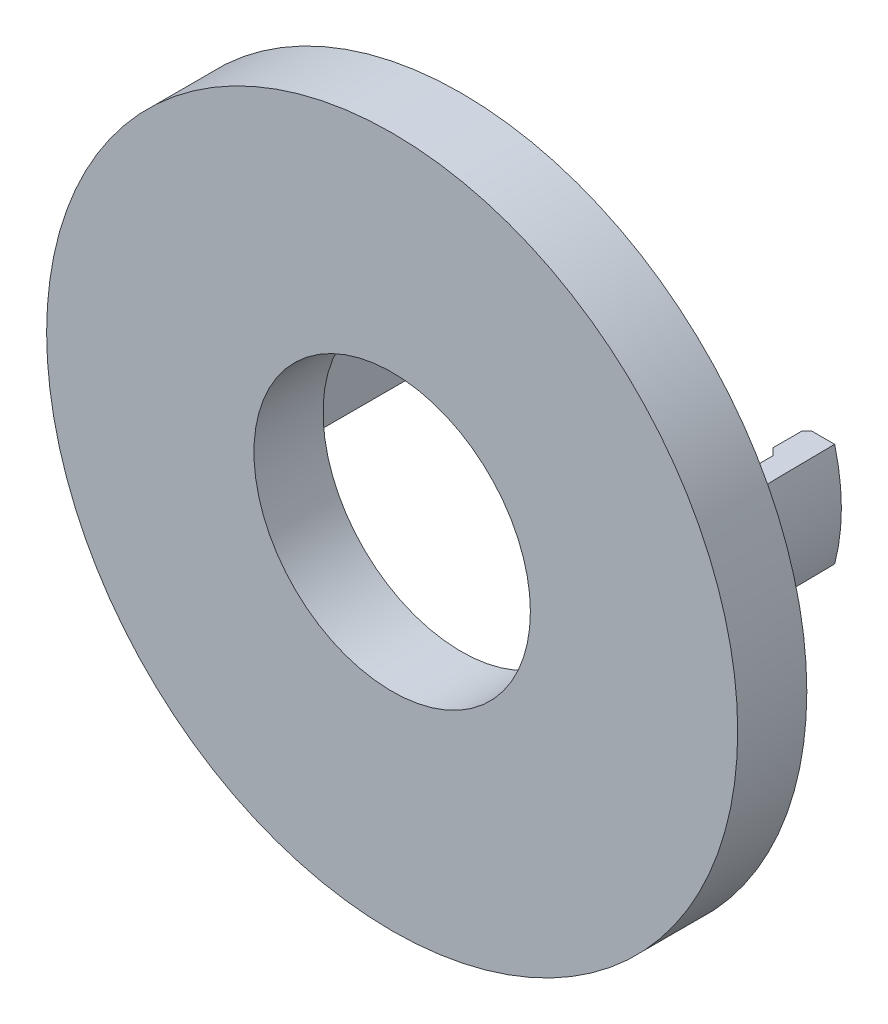
ISO-10303-21;
HEADER;
FILE_DESCRIPTION(('STEP AP214'),'2;1');
FILE_NAME('part.step','',(''),(''),'','','');
FILE_SCHEMA(('AUTOMOTIVE_DESIGN { 1 0 10303 214 1 1 1 1 }'));
ENDSEC;
DATA;
#1=APPLICATION_CONTEXT('core data for automotive mechanical design processes');
#2=APPLICATION_PROTOCOL_DEFINITION('international standard','automotive_design',2000,#1);
#3=PRODUCT_CONTEXT('',#1,'mechanical');
#4=PRODUCT('Part','Part','',(#3));
#5=PRODUCT_RELATED_PRODUCT_CATEGORY('part','',(#4));
#6=PRODUCT_DEFINITION_FORMATION('','',#4);
#7=PRODUCT_DEFINITION_CONTEXT('part definition',#1,'design');
#8=PRODUCT_DEFINITION('design','',#6,#7);
#9=PRODUCT_DEFINITION_SHAPE('','',#8);
#10=(LENGTH_UNIT() NAMED_UNIT(*) SI_UNIT(.MILLI.,.METRE.));
#11=(NAMED_UNIT(*) PLANE_ANGLE_UNIT() SI_UNIT($,.RADIAN.));
#12=(NAMED_UNIT(*) SI_UNIT($,.STERADIAN.) SOLID_ANGLE_UNIT());
#13=UNCERTAINTY_MEASURE_WITH_UNIT(LENGTH_MEASURE(1.E-05),#10,'distance_accuracy_value','');
#14=(GEOMETRIC_REPRESENTATION_CONTEXT(3) GLOBAL_UNCERTAINTY_ASSIGNED_CONTEXT((#13)) GLOBAL_UNIT_ASSIGNED_CONTEXT((#10,
#11,#12)) REPRESENTATION_CONTEXT('',''));
#15=CARTESIAN_POINT('',(0.,0.,0.));
#16=DIRECTION('',(0.,0.,1.));
#17=DIRECTION('',(1.,0.,0.));
#18=AXIS2_PLACEMENT_3D('',#15,#16,#17);
#19=CARTESIAN_POINT('',(0.,0.,0.));
#20=DIRECTION('',(0.,0.,1.));
#21=DIRECTION('',(1.,0.,0.));
#22=AXIS2_PLACEMENT_3D('',#19,#20,#21);
#23=PLANE('',#22);
#24=CARTESIAN_POINT('',(0.,0.,0.));
#25=DIRECTION('',(0.,0.,1.));
#26=DIRECTION('',(1.,0.,0.));
#27=AXIS2_PLACEMENT_3D('',#24,#25,#26);
#28=CIRCLE('',#27,15.5);
#29=CARTESIAN_POINT('',(15.039531242695,-3.75,0.));
#30=VERTEX_POINT('',#29);
#31=CARTESIAN_POINT('',(15.039531242695,3.75,0.));
#32=VERTEX_POINT('',#31);
#33=EDGE_CURVE('E56',#30,#32,#28,.T.);
#34=ORIENTED_EDGE('',*,*,#33,.T.);
#35=DIRECTION('',(-1.,0.,0.));
#36=VECTOR('',#35,1.);
#37=CARTESIAN_POINT('',(0.,3.75,0.));
#38=LINE('',#37,#36);
#39=CARTESIAN_POINT('',(10.3535533905933,3.75,0.));
#40=VERTEX_POINT('',#39);
#41=EDGE_CURVE('E61',#32,#40,#38,.T.);
#42=ORIENTED_EDGE('',*,*,#41,.T.);
#43=DIRECTION('',(0.,1.,0.));
#44=VECTOR('',#43,1.);
#45=CARTESIAN_POINT('',(10.3535533905933,-3.75,0.));
#46=LINE('',#45,#44);
#47=CARTESIAN_POINT('',(10.3535533905933,-3.75,0.));
#48=VERTEX_POINT('',#47);
#49=EDGE_CURVE('E321',#48,#40,#46,.T.);
#50=ORIENTED_EDGE('',*,*,#49,.F.);
#51=DIRECTION('',(-1.,0.,0.));
#52=VECTOR('',#51,1.);
#53=CARTESIAN_POINT('',(0.,-3.75,0.));
#54=LINE('',#53,#52);
#55=EDGE_CURVE('E350',#30,#48,#54,.T.);
#56=ORIENTED_EDGE('',*,*,#55,.F.);
#57=EDGE_LOOP('',(#34,#42,#50,#56));
#58=FACE_BOUND('',#57,.T.);
#59=DIRECTION('',(1.,0.,0.));
#60=VECTOR('',#59,1.);
#61=CARTESIAN_POINT('',(0.,3.75,0.));
#62=LINE('',#61,#60);
#63=CARTESIAN_POINT('',(-15.039531242695,3.75,0.));
#64=VERTEX_POINT('',#63);
#65=CARTESIAN_POINT('',(-10.3535533905933,3.75,0.));
#66=VERTEX_POINT('',#65);
#67=EDGE_CURVE('E167',#64,#66,#62,.T.);
#68=ORIENTED_EDGE('',*,*,#67,.F.);
#69=CARTESIAN_POINT('',(0.,0.,0.));
#70=DIRECTION('',(0.,0.,-1.));
#71=DIRECTION('',(-1.,0.,0.));
#72=AXIS2_PLACEMENT_3D('',#69,#70,#71);
#73=CIRCLE('',#72,15.5);
#74=CARTESIAN_POINT('',(-15.039531242695,-3.75,0.));
#75=VERTEX_POINT('',#74);
#76=EDGE_CURVE('E152',#75,#64,#73,.T.);
#77=ORIENTED_EDGE('',*,*,#76,.F.);
#78=DIRECTION('',(1.,0.,0.));
#79=VECTOR('',#78,1.);
#80=CARTESIAN_POINT('',(0.,-3.75,0.));
#81=LINE('',#80,#79);
#82=CARTESIAN_POINT('',(-10.3535533905933,-3.75,0.));
#83=VERTEX_POINT('',#82);
#84=EDGE_CURVE('E198',#75,#83,#81,.T.);
#85=ORIENTED_EDGE('',*,*,#84,.T.);
#86=DIRECTION('',(0.,1.,0.));
#87=VECTOR('',#86,1.);
#88=CARTESIAN_POINT('',(-10.3535533905933,-3.75,0.));
#89=LINE('',#88,#87);
#90=EDGE_CURVE('E175',#83,#66,#89,.T.);
#91=ORIENTED_EDGE('',*,*,#90,.T.);
#92=EDGE_LOOP('',(#68,#77,#85,#91));
#93=FACE_BOUND('',#92,.T.);
#94=CARTESIAN_POINT('',(0.,0.,0.));
#95=DIRECTION('',(0.,0.,1.));
#96=DIRECTION('',(1.,0.,0.));
#97=AXIS2_PLACEMENT_3D('',#94,#95,#96);
#98=CIRCLE('',#97,10.);
#99=CARTESIAN_POINT('',(10.,0.,0.));
#100=VERTEX_POINT('',#99);
#101=EDGE_CURVE('E314',#100,#100,#98,.T.);
#102=ORIENTED_EDGE('',*,*,#101,.T.);
#103=EDGE_LOOP('',(#102));
#104=FACE_BOUND('',#103,.T.);
#105=CARTESIAN_POINT('',(0.,0.,0.));
#106=DIRECTION('',(0.,0.,1.));
#107=DIRECTION('',(1.,0.,0.));
#108=AXIS2_PLACEMENT_3D('',#105,#106,#107);
#109=CIRCLE('',#108,25.);
#110=CARTESIAN_POINT('',(25.,0.,0.));
#111=VERTEX_POINT('',#110);
#112=EDGE_CURVE('E312',#111,#111,#109,.T.);
#113=ORIENTED_EDGE('',*,*,#112,.F.);
#114=EDGE_LOOP('',(#113));
#115=FACE_BOUND('',#114,.T.);
#116=ADVANCED_FACE('F36',(#58,#93,#104,#115),#23,.F.);
#117=CARTESIAN_POINT('',(0.,0.,5.));
#118=DIRECTION('',(0.,0.,-1.));
#119=DIRECTION('',(-1.,0.,0.));
#120=AXIS2_PLACEMENT_3D('',#117,#118,#119);
#121=CYLINDRICAL_SURFACE('',#120,25.);
#122=CARTESIAN_POINT('',(0.,0.,5.));
#123=DIRECTION('',(0.,0.,1.));
#124=DIRECTION('',(1.,0.,0.));
#125=AXIS2_PLACEMENT_3D('',#122,#123,#124);
#126=CIRCLE('',#125,25.);
#127=CARTESIAN_POINT('',(25.,0.,5.));
#128=VERTEX_POINT('',#127);
#129=EDGE_CURVE('E309',#128,#128,#126,.T.);
#130=ORIENTED_EDGE('',*,*,#129,.F.);
#131=EDGE_LOOP('',(#130));
#132=FACE_BOUND('',#131,.T.);
#133=ORIENTED_EDGE('',*,*,#112,.T.);
#134=EDGE_LOOP('',(#133));
#135=FACE_BOUND('',#134,.T.);
#136=ADVANCED_FACE('F38',(#132,#135),#121,.T.);
#137=CARTESIAN_POINT('',(0.,0.,5.));
#138=DIRECTION('',(0.,0.,1.));
#139=DIRECTION('',(1.,0.,0.));
#140=AXIS2_PLACEMENT_3D('',#137,#138,#139);
#141=PLANE('',#140);
#142=CARTESIAN_POINT('',(0.,0.,5.));
#143=DIRECTION('',(0.,0.,1.));
#144=DIRECTION('',(1.,0.,0.));
#145=AXIS2_PLACEMENT_3D('',#142,#143,#144);
#146=CIRCLE('',#145,10.);
#147=CARTESIAN_POINT('',(10.,0.,5.));
#148=VERTEX_POINT('',#147);
#149=EDGE_CURVE('E317',#148,#148,#146,.T.);
#150=ORIENTED_EDGE('',*,*,#149,.F.);
#151=EDGE_LOOP('',(#150));
#152=FACE_BOUND('',#151,.T.);
#153=ORIENTED_EDGE('',*,*,#129,.T.);
#154=EDGE_LOOP('',(#153));
#155=FACE_BOUND('',#154,.T.);
#156=ADVANCED_FACE('F295',(#152,#155),#141,.T.);
#157=CARTESIAN_POINT('',(0.,0.,0.));
#158=DIRECTION('',(0.,0.,1.));
#159=DIRECTION('',(1.,0.,0.));
#160=AXIS2_PLACEMENT_3D('',#157,#158,#159);
#161=CYLINDRICAL_SURFACE('',#160,10.);
#162=ORIENTED_EDGE('',*,*,#101,.F.);
#163=EDGE_LOOP('',(#162));
#164=FACE_BOUND('',#163,.T.);
#165=ORIENTED_EDGE('',*,*,#149,.T.);
#166=EDGE_LOOP('',(#165));
#167=FACE_BOUND('',#166,.T.);
#168=ADVANCED_FACE('F273',(#164,#167),#161,.F.);
#169=CARTESIAN_POINT('',(5.17677669529669,-3.75,5.17677669529664));
#170=DIRECTION('',(-0.707106781186551,0.,-0.707106781186544));
#171=DIRECTION('',(-0.707106781186544,0.,0.707106781186551));
#172=AXIS2_PLACEMENT_3D('',#169,#170,#171);
#173=PLANE('',#172);
#174=ORIENTED_EDGE('',*,*,#49,.T.);
#175=DIRECTION('',(-0.707106781186544,0.,0.707106781186551));
#176=VECTOR('',#175,1.);
#177=CARTESIAN_POINT('',(5.17677669529669,3.75,5.17677669529664));
#178=LINE('',#177,#176);
#179=CARTESIAN_POINT('',(12.75,3.75,-2.39644660940675));
#180=VERTEX_POINT('',#179);
#181=EDGE_CURVE('E352',#180,#40,#178,.T.);
#182=ORIENTED_EDGE('',*,*,#181,.F.);
#183=DIRECTION('',(0.,1.,0.));
#184=VECTOR('',#183,1.);
#185=CARTESIAN_POINT('',(12.75,-3.75,-2.39644660940675));
#186=LINE('',#185,#184);
#187=CARTESIAN_POINT('',(12.75,-3.75,-2.39644660940675));
#188=VERTEX_POINT('',#187);
#189=EDGE_CURVE('E332',#188,#180,#186,.T.);
#190=ORIENTED_EDGE('',*,*,#189,.F.);
#191=DIRECTION('',(-0.707106781186544,0.,0.707106781186551));
#192=VECTOR('',#191,1.);
#193=CARTESIAN_POINT('',(5.17677669529669,-3.75,5.17677669529664));
#194=LINE('',#193,#192);
#195=EDGE_CURVE('E326',#188,#48,#194,.T.);
#196=ORIENTED_EDGE('',*,*,#195,.T.);
#197=EDGE_LOOP('',(#174,#182,#190,#196));
#198=FACE_BOUND('',#197,.T.);
#199=ADVANCED_FACE('F269',(#198),#173,.T.);
#200=CARTESIAN_POINT('',(12.75,-3.75,0.));
#201=DIRECTION('',(-1.,0.,0.));
#202=DIRECTION('',(0.,0.,1.));
#203=AXIS2_PLACEMENT_3D('',#200,#201,#202);
#204=PLANE('',#203);
#205=ORIENTED_EDGE('',*,*,#189,.T.);
#206=DIRECTION('',(0.,0.,1.));
#207=VECTOR('',#206,1.);
#208=CARTESIAN_POINT('',(12.75,3.75,0.));
#209=LINE('',#208,#207);
#210=CARTESIAN_POINT('',(12.75,3.75,-9.81066017177982));
#211=VERTEX_POINT('',#210);
#212=EDGE_CURVE('E354',#211,#180,#209,.T.);
#213=ORIENTED_EDGE('',*,*,#212,.F.);
#214=DIRECTION('',(0.,1.,0.));
#215=VECTOR('',#214,1.);
#216=CARTESIAN_POINT('',(12.75,-3.75,-9.81066017177982));
#217=LINE('',#216,#215);
#218=CARTESIAN_POINT('',(12.75,-3.75,-9.81066017177982));
#219=VERTEX_POINT('',#218);
#220=EDGE_CURVE('E330',#219,#211,#217,.T.);
#221=ORIENTED_EDGE('',*,*,#220,.F.);
#222=DIRECTION('',(0.,0.,1.));
#223=VECTOR('',#222,1.);
#224=CARTESIAN_POINT('',(12.75,-3.75,0.));
#225=LINE('',#224,#223);
#226=EDGE_CURVE('E338',#219,#188,#225,.T.);
#227=ORIENTED_EDGE('',*,*,#226,.T.);
#228=EDGE_LOOP('',(#205,#213,#221,#227));
#229=FACE_BOUND('',#228,.T.);
#230=ADVANCED_FACE('F272',(#229),#204,.T.);
#231=CARTESIAN_POINT('',(11.2803300858899,-3.75,-11.2803300858899));
#232=DIRECTION('',(0.707106781186549,0.,-0.707106781186546));
#233=DIRECTION('',(-0.707106781186546,0.,-0.707106781186549));
#234=AXIS2_PLACEMENT_3D('',#231,#232,#233);
#235=PLANE('',#234);
#236=ORIENTED_EDGE('',*,*,#220,.T.);
#237=DIRECTION('',(-0.707106781186546,0.,-0.707106781186549));
#238=VECTOR('',#237,1.);
#239=CARTESIAN_POINT('',(11.2803300858899,3.75,-11.2803300858899));
#240=LINE('',#239,#238);
#241=CARTESIAN_POINT('',(12.25,3.75,-10.3106601717798));
#242=VERTEX_POINT('',#241);
#243=EDGE_CURVE('E357',#211,#242,#240,.T.);
#244=ORIENTED_EDGE('',*,*,#243,.T.);
#245=DIRECTION('',(0.,1.,0.));
#246=VECTOR('',#245,1.);
#247=CARTESIAN_POINT('',(12.25,-3.75,-10.3106601717798));
#248=LINE('',#247,#246);
#249=CARTESIAN_POINT('',(12.25,-3.75,-10.3106601717798));
#250=VERTEX_POINT('',#249);
#251=EDGE_CURVE('E328',#250,#242,#248,.T.);
#252=ORIENTED_EDGE('',*,*,#251,.F.);
#253=DIRECTION('',(-0.707106781186546,0.,-0.707106781186549));
#254=VECTOR('',#253,1.);
#255=CARTESIAN_POINT('',(11.2803300858899,-3.75,-11.2803300858899));
#256=LINE('',#255,#254);
#257=EDGE_CURVE('E341',#219,#250,#256,.T.);
#258=ORIENTED_EDGE('',*,*,#257,.F.);
#259=EDGE_LOOP('',(#236,#244,#252,#258));
#260=FACE_BOUND('',#259,.T.);
#261=ADVANCED_FACE('F277',(#260),#235,.F.);
#262=CARTESIAN_POINT('',(12.25,-3.75,0.));
#263=DIRECTION('',(1.,0.,0.));
#264=DIRECTION('',(0.,0.,-1.));
#265=AXIS2_PLACEMENT_3D('',#262,#263,#264);
#266=PLANE('',#265);
#267=ORIENTED_EDGE('',*,*,#251,.T.);
#268=DIRECTION('',(0.,0.,-1.));
#269=VECTOR('',#268,1.);
#270=CARTESIAN_POINT('',(12.25,3.75,0.));
#271=LINE('',#270,#269);
#272=CARTESIAN_POINT('',(12.25,3.75,-12.3964466094067));
#273=VERTEX_POINT('',#272);
#274=EDGE_CURVE('E360',#242,#273,#271,.T.);
#275=ORIENTED_EDGE('',*,*,#274,.T.);
#276=DIRECTION('',(0.,1.,0.));
#277=VECTOR('',#276,1.);
#278=CARTESIAN_POINT('',(12.25,-3.75,-12.3964466094067));
#279=LINE('',#278,#277);
#280=CARTESIAN_POINT('',(12.25,-3.75,-12.3964466094067));
#281=VERTEX_POINT('',#280);
#282=EDGE_CURVE('E325',#281,#273,#279,.T.);
#283=ORIENTED_EDGE('',*,*,#282,.F.);
#284=DIRECTION('',(0.,0.,-1.));
#285=VECTOR('',#284,1.);
#286=CARTESIAN_POINT('',(12.25,-3.75,0.));
#287=LINE('',#286,#285);
#288=EDGE_CURVE('E343',#250,#281,#287,.T.);
#289=ORIENTED_EDGE('',*,*,#288,.F.);
#290=EDGE_LOOP('',(#267,#275,#283,#289));
#291=FACE_BOUND('',#290,.T.);
#292=ADVANCED_FACE('F281',(#291),#266,.F.);
#293=CARTESIAN_POINT('',(-0.0732233047033926,-3.75,-0.0732233047033929));
#294=DIRECTION('',(0.707106781186546,0.,0.707106781186549));
#295=DIRECTION('',(0.707106781186549,0.,-0.707106781186546));
#296=AXIS2_PLACEMENT_3D('',#293,#294,#295);
#297=PLANE('',#296);
#298=ORIENTED_EDGE('',*,*,#282,.T.);
#299=DIRECTION('',(0.707106781186549,0.,-0.707106781186546));
#300=VECTOR('',#299,1.);
#301=CARTESIAN_POINT('',(-0.0732233047033926,3.75,-0.0732233047033929));
#302=LINE('',#301,#300);
#303=CARTESIAN_POINT('',(12.6035533905933,3.75,-12.75));
#304=VERTEX_POINT('',#303);
#305=EDGE_CURVE('E363',#273,#304,#302,.T.);
#306=ORIENTED_EDGE('',*,*,#305,.T.);
#307=DIRECTION('',(0.,1.,0.));
#308=VECTOR('',#307,1.);
#309=CARTESIAN_POINT('',(12.6035533905933,-3.75,-12.75));
#310=LINE('',#309,#308);
#311=CARTESIAN_POINT('',(12.6035533905933,-3.75,-12.75));
#312=VERTEX_POINT('',#311);
#313=EDGE_CURVE('E323',#312,#304,#310,.T.);
#314=ORIENTED_EDGE('',*,*,#313,.F.);
#315=DIRECTION('',(0.707106781186549,0.,-0.707106781186546));
#316=VECTOR('',#315,1.);
#317=CARTESIAN_POINT('',(-0.0732233047033926,-3.75,-0.0732233047033929));
#318=LINE('',#317,#316);
#319=EDGE_CURVE('E345',#281,#312,#318,.T.);
#320=ORIENTED_EDGE('',*,*,#319,.F.);
#321=EDGE_LOOP('',(#298,#306,#314,#320));
#322=FACE_BOUND('',#321,.T.);
#323=ADVANCED_FACE('F285',(#322),#297,.F.);
#324=CARTESIAN_POINT('',(0.,-3.75,-12.75));
#325=DIRECTION('',(0.,0.,1.));
#326=DIRECTION('',(1.,0.,0.));
#327=AXIS2_PLACEMENT_3D('',#324,#325,#326);
#328=PLANE('',#327);
#329=DIRECTION('',(1.,0.,0.));
#330=VECTOR('',#329,1.);
#331=CARTESIAN_POINT('',(0.,3.75,-12.75));
#332=LINE('',#331,#330);
#333=CARTESIAN_POINT('',(14.2653426176871,3.75,-12.75));
#334=VERTEX_POINT('',#333);
#335=EDGE_CURVE('E365',#304,#334,#332,.T.);
#336=ORIENTED_EDGE('',*,*,#335,.T.);
#337=CARTESIAN_POINT('',(0.,0.,-12.75));
#338=DIRECTION('',(0.,0.,1.));
#339=DIRECTION('',(1.,0.,0.));
#340=AXIS2_PLACEMENT_3D('',#337,#338,#339);
#341=CIRCLE('',#340,14.75);
#342=CARTESIAN_POINT('',(14.2653426176871,-3.75,-12.75));
#343=VERTEX_POINT('',#342);
#344=EDGE_CURVE('E261',#343,#334,#341,.T.);
#345=ORIENTED_EDGE('',*,*,#344,.F.);
#346=DIRECTION('',(1.,0.,0.));
#347=VECTOR('',#346,1.);
#348=CARTESIAN_POINT('',(0.,-3.75,-12.75));
#349=LINE('',#348,#347);
#350=EDGE_CURVE('E347',#312,#343,#349,.T.);
#351=ORIENTED_EDGE('',*,*,#350,.F.);
#352=ORIENTED_EDGE('',*,*,#313,.T.);
#353=EDGE_LOOP('',(#336,#345,#351,#352));
#354=FACE_BOUND('',#353,.T.);
#355=ADVANCED_FACE('F267',(#354),#328,.F.);
#356=CARTESIAN_POINT('',(0.,-3.75,0.));
#357=DIRECTION('',(0.,1.,0.));
#358=DIRECTION('',(0.,0.,1.));
#359=AXIS2_PLACEMENT_3D('',#356,#357,#358);
#360=PLANE('',#359);
#361=ORIENTED_EDGE('',*,*,#350,.T.);
#362=CARTESIAN_POINT('',(14.2653426176871,-3.75,-12.75));
#363=CARTESIAN_POINT('',(14.2653500910361,-3.75,-12.3961589505586));
#364=CARTESIAN_POINT('',(14.2661845081766,-3.75,-12.0423166032924));
#365=CARTESIAN_POINT('',(14.2697384971241,-3.75,-11.3346108956683));
#366=CARTESIAN_POINT('',(14.2724582324036,-3.75,-10.9807475361491));
#367=CARTESIAN_POINT('',(14.2800143207087,-3.75,-10.273031792079));
#368=CARTESIAN_POINT('',(14.2848507393399,-3.75,-9.91917940820826));
#369=CARTESIAN_POINT('',(14.2969507670398,-3.75,-9.21074937713185));
#370=CARTESIAN_POINT('',(14.3042196059621,-3.75,-8.85617181753099));
#371=CARTESIAN_POINT('',(14.3215540726288,-3.75,-8.14709279050959));
#372=CARTESIAN_POINT('',(14.3316196330507,-3.75,-7.79259132146296));
#373=CARTESIAN_POINT('',(14.355023351933,-3.75,-7.08369823996048));
#374=CARTESIAN_POINT('',(14.3683614684174,-3.74999999999998,-6.72930662615393));
#375=CARTESIAN_POINT('',(14.3913224155745,-3.74999999999999,-6.19733566895319));
#376=CARTESIAN_POINT('',(14.3994822113355,-3.75,-6.01969270757438));
#377=CARTESIAN_POINT('',(14.416887413724,-3.75,-5.66446084663767));
#378=CARTESIAN_POINT('',(14.4261328128766,-3.75,-5.48687194671597));
#379=CARTESIAN_POINT('',(14.4458265073767,-3.75,-5.13176386300204));
#380=CARTESIAN_POINT('',(14.4562747806969,-3.75,-4.95424467799288));
#381=CARTESIAN_POINT('',(14.4785066127611,-3.75,-4.59943269605847));
#382=CARTESIAN_POINT('',(14.4902890921582,-3.75,-4.42213983182587));
#383=CARTESIAN_POINT('',(14.5153663938405,-3.75,-4.06765714667967));
#384=CARTESIAN_POINT('',(14.5286612450936,-3.75,-3.89046732780515));
#385=CARTESIAN_POINT('',(14.5569730697761,-3.75,-3.53621056875449));
#386=CARTESIAN_POINT('',(14.5719901782072,-3.75,-3.35914363930718));
#387=CARTESIAN_POINT('',(14.6040825641808,-3.75,-3.00435025605194));
#388=CARTESIAN_POINT('',(14.6211672480441,-3.75,-2.82662464799028));
#389=CARTESIAN_POINT('',(14.6576747417836,-3.75,-2.4714225262793));
#390=CARTESIAN_POINT('',(14.6770974122446,-3.75,-2.29394599841504));
#391=CARTESIAN_POINT('',(14.7187222990907,-3.75,-1.93934975173721));
#392=CARTESIAN_POINT('',(14.7409240124281,-3.75,-1.7622299742276));
#393=CARTESIAN_POINT('',(14.788741283113,-3.75,-1.4081825944695));
#394=CARTESIAN_POINT('',(14.8143617505427,-3.75,-1.2312556446794));
#395=CARTESIAN_POINT('',(14.855981732399,-3.75,-0.966351657653776));
#396=CARTESIAN_POINT('',(14.8703880138809,-3.75,-0.878123662890954));
#397=CARTESIAN_POINT('',(14.9004113438489,-3.75,-0.701875519818639));
#398=CARTESIAN_POINT('',(14.9160283598067,-3.75,-0.613855365990621));
#399=CARTESIAN_POINT('',(14.9486582378317,-3.75,-0.438000698948808));
#400=CARTESIAN_POINT('',(14.9656721900315,-3.75,-0.350166386652507));
#401=CARTESIAN_POINT('',(15.001324344317,-3.75,-0.174820333453566));
#402=CARTESIAN_POINT('',(15.0199626967413,-3.75,-0.0873086231906695));
#403=CARTESIAN_POINT('',(15.039531242695,-3.75,0.));
#404=B_SPLINE_CURVE_WITH_KNOTS('',3,(#362,#363,#364,#365,#366,#367,#368,#369,#370,#371,#372,
#373,#374,#375,#376,#377,#378,#379,#380,#381,#382,#383,#384,#385,#386,#387,#388,#389,#390,#391,
#392,#393,#394,#395,#396,#397,#398,#399,#400,#401,#402,#403),.UNSPECIFIED.,.F.,.F.,(4,2,2,2,2,2,
2,2,2,2,2,2,2,2,2,2,2,2,2,2,4),(0.,1.06152413863515,2.12314033161648,3.18478943120855,
4.24873596673261,5.31265689318907,6.37656417375401,6.91005229208031,7.44353673731664,
7.97701141479935,8.51005756392754,9.04311392471862,9.5762120985037,10.1118338179439,
10.6474236138006,11.1829165998254,11.7191871198261,11.9873695599756,12.2555447975096,
12.5239313382018,12.7923427445369),.UNSPECIFIED.);
#405=EDGE_CURVE('E255',#343,#30,#404,.T.);
#406=ORIENTED_EDGE('',*,*,#405,.T.);
#407=ORIENTED_EDGE('',*,*,#55,.T.);
#408=ORIENTED_EDGE('',*,*,#195,.F.);
#409=ORIENTED_EDGE('',*,*,#226,.F.);
#410=ORIENTED_EDGE('',*,*,#257,.T.);
#411=ORIENTED_EDGE('',*,*,#288,.T.);
#412=ORIENTED_EDGE('',*,*,#319,.T.);
#413=EDGE_LOOP('',(#361,#406,#407,#408,#409,#410,#411,#412));
#414=FACE_BOUND('',#413,.T.);
#415=ADVANCED_FACE('F263',(#414),#360,.F.);
#416=CARTESIAN_POINT('',(0.,3.75,0.));
#417=DIRECTION('',(0.,1.,0.));
#418=DIRECTION('',(0.,0.,1.));
#419=AXIS2_PLACEMENT_3D('',#416,#417,#418);
#420=PLANE('',#419);
#421=CARTESIAN_POINT('',(14.2653426176871,3.75,-12.75));
#422=CARTESIAN_POINT('',(14.2653500910361,3.75,-12.3961589505586));
#423=CARTESIAN_POINT('',(14.2661845081766,3.75,-12.0423166032924));
#424=CARTESIAN_POINT('',(14.2697384971241,3.75,-11.3346108956683));
#425=CARTESIAN_POINT('',(14.2724582324036,3.75,-10.9807475361491));
#426=CARTESIAN_POINT('',(14.2800143207087,3.75,-10.273031792079));
#427=CARTESIAN_POINT('',(14.2848507393399,3.75,-9.91917940820826));
#428=CARTESIAN_POINT('',(14.2969507670398,3.75,-9.21074937713185));
#429=CARTESIAN_POINT('',(14.3042196059621,3.75,-8.85617181753099));
#430=CARTESIAN_POINT('',(14.3215540726288,3.75,-8.14709279050959));
#431=CARTESIAN_POINT('',(14.3316196330507,3.75,-7.79259132146296));
#432=CARTESIAN_POINT('',(14.355023351933,3.75,-7.08369823996048));
#433=CARTESIAN_POINT('',(14.3683614684174,3.75,-6.72930662615393));
#434=CARTESIAN_POINT('',(14.3913224155745,3.75,-6.19733566895319));
#435=CARTESIAN_POINT('',(14.3994822113355,3.75,-6.01969270757438));
#436=CARTESIAN_POINT('',(14.416887413724,3.75,-5.66446084663767));
#437=CARTESIAN_POINT('',(14.4261328128766,3.75,-5.48687194671597));
#438=CARTESIAN_POINT('',(14.4458265073767,3.75,-5.13176386300204));
#439=CARTESIAN_POINT('',(14.4562747806969,3.75,-4.95424467799288));
#440=CARTESIAN_POINT('',(14.4785066127611,3.75,-4.59943269605847));
#441=CARTESIAN_POINT('',(14.4902890921582,3.75,-4.42213983182587));
#442=CARTESIAN_POINT('',(14.5153663938405,3.75,-4.06765714667967));
#443=CARTESIAN_POINT('',(14.5286612450936,3.75,-3.89046732780515));
#444=CARTESIAN_POINT('',(14.5569730697761,3.75,-3.53621056875449));
#445=CARTESIAN_POINT('',(14.5719901782072,3.75,-3.35914363930718));
#446=CARTESIAN_POINT('',(14.6040825641808,3.75,-3.00435025605194));
#447=CARTESIAN_POINT('',(14.6211672480441,3.75,-2.82662464799028));
#448=CARTESIAN_POINT('',(14.6576747417836,3.75,-2.4714225262793));
#449=CARTESIAN_POINT('',(14.6770974122446,3.75,-2.29394599841504));
#450=CARTESIAN_POINT('',(14.7187222990907,3.75,-1.93934975173721));
#451=CARTESIAN_POINT('',(14.7409240124281,3.75,-1.7622299742276));
#452=CARTESIAN_POINT('',(14.788741283113,3.75,-1.4081825944695));
#453=CARTESIAN_POINT('',(14.8143617505427,3.75,-1.2312556446794));
#454=CARTESIAN_POINT('',(14.855981732399,3.75,-0.966351657653776));
#455=CARTESIAN_POINT('',(14.8703880138809,3.75,-0.878123662890954));
#456=CARTESIAN_POINT('',(14.9004113438489,3.75,-0.701875519818639));
#457=CARTESIAN_POINT('',(14.9160283598067,3.75,-0.613855365990621));
#458=CARTESIAN_POINT('',(14.9486582378317,3.75,-0.438000698948807));
#459=CARTESIAN_POINT('',(14.9656721900315,3.75,-0.350166386652508));
#460=CARTESIAN_POINT('',(15.001324344317,3.75,-0.174820333453567));
#461=CARTESIAN_POINT('',(15.0199626967413,3.75,-0.0873086231906698));
#462=CARTESIAN_POINT('',(15.039531242695,3.75,0.));
#463=B_SPLINE_CURVE_WITH_KNOTS('',3,(#421,#422,#423,#424,#425,#426,#427,#428,#429,#430,#431,
#432,#433,#434,#435,#436,#437,#438,#439,#440,#441,#442,#443,#444,#445,#446,#447,#448,#449,#450,
#451,#452,#453,#454,#455,#456,#457,#458,#459,#460,#461,#462),.UNSPECIFIED.,.F.,.F.,(4,2,2,2,2,2,
2,2,2,2,2,2,2,2,2,2,2,2,2,2,4),(0.,1.06152413863515,2.12314033161648,3.18478943120855,
4.24873596673261,5.31265689318907,6.37656417375401,6.91005229208031,7.44353673731664,
7.97701141479935,8.51005756392754,9.04311392471862,9.5762120985037,10.1118338179439,
10.6474236138006,11.1829165998254,11.7191871198261,11.9873695599756,12.2555447975096,
12.5239313382018,12.7923427445369),.UNSPECIFIED.);
#464=EDGE_CURVE('E49',#334,#32,#463,.T.);
#465=ORIENTED_EDGE('',*,*,#464,.F.);
#466=ORIENTED_EDGE('',*,*,#335,.F.);
#467=ORIENTED_EDGE('',*,*,#305,.F.);
#468=ORIENTED_EDGE('',*,*,#274,.F.);
#469=ORIENTED_EDGE('',*,*,#243,.F.);
#470=ORIENTED_EDGE('',*,*,#212,.T.);
#471=ORIENTED_EDGE('',*,*,#181,.T.);
#472=ORIENTED_EDGE('',*,*,#41,.F.);
#473=EDGE_LOOP('',(#465,#466,#467,#468,#469,#470,#471,#472));
#474=FACE_BOUND('',#473,.T.);
#475=ADVANCED_FACE('F243',(#474),#420,.T.);
#476=CARTESIAN_POINT('',(14.75,0.,-12.75));
#477=CARTESIAN_POINT('',(14.75,0.,-3.44644662573699));
#478=CARTESIAN_POINT('',(15.5,0.,0.));
#479=B_SPLINE_CURVE_WITH_KNOTS('',2,(#476,#477,#478),.UNSPECIFIED.,.F.,.F.,(3,3),(0.,1.),.UNSPECIFIED.);
#480=CARTESIAN_POINT('',(0.,0.,0.));
#481=DIRECTION('',(0.,0.,1.));
#482=AXIS1_PLACEMENT('',#480,#481);
#483=SURFACE_OF_REVOLUTION('',#479,#482);
#484=ORIENTED_EDGE('',*,*,#344,.T.);
#485=ORIENTED_EDGE('',*,*,#464,.T.);
#486=ORIENTED_EDGE('',*,*,#33,.F.);
#487=ORIENTED_EDGE('',*,*,#405,.F.);
#488=EDGE_LOOP('',(#484,#485,#486,#487));
#489=FACE_BOUND('',#488,.T.);
#490=ADVANCED_FACE('F237',(#489),#483,.T.);
#491=CARTESIAN_POINT('',(0.,-3.75,-12.75));
#492=DIRECTION('',(0.,0.,-1.));
#493=DIRECTION('',(-1.,0.,0.));
#494=AXIS2_PLACEMENT_3D('',#491,#492,#493);
#495=PLANE('',#494);
#496=CARTESIAN_POINT('',(0.,0.,-12.75));
#497=DIRECTION('',(0.,0.,-1.));
#498=DIRECTION('',(-1.,0.,0.));
#499=AXIS2_PLACEMENT_3D('',#496,#497,#498);
#500=CIRCLE('',#499,14.75);
#501=CARTESIAN_POINT('',(-14.2653426176871,-3.75,-12.75));
#502=VERTEX_POINT('',#501);
#503=CARTESIAN_POINT('',(-14.2653426176871,3.75,-12.75));
#504=VERTEX_POINT('',#503);
#505=EDGE_CURVE('E161',#502,#504,#500,.T.);
#506=ORIENTED_EDGE('',*,*,#505,.T.);
#507=DIRECTION('',(-1.,0.,0.));
#508=VECTOR('',#507,1.);
#509=CARTESIAN_POINT('',(0.,3.75,-12.75));
#510=LINE('',#509,#508);
#511=CARTESIAN_POINT('',(-12.6035533905933,3.75,-12.75));
#512=VERTEX_POINT('',#511);
#513=EDGE_CURVE('E171',#512,#504,#510,.T.);
#514=ORIENTED_EDGE('',*,*,#513,.F.);
#515=DIRECTION('',(0.,1.,0.));
#516=VECTOR('',#515,1.);
#517=CARTESIAN_POINT('',(-12.6035533905933,-3.75,-12.75));
#518=LINE('',#517,#516);
#519=CARTESIAN_POINT('',(-12.6035533905933,-3.75,-12.75));
#520=VERTEX_POINT('',#519);
#521=EDGE_CURVE('E217',#520,#512,#518,.T.);
#522=ORIENTED_EDGE('',*,*,#521,.F.);
#523=DIRECTION('',(-1.,0.,0.));
#524=VECTOR('',#523,1.);
#525=CARTESIAN_POINT('',(0.,-3.75,-12.75));
#526=LINE('',#525,#524);
#527=EDGE_CURVE('E214',#520,#502,#526,.T.);
#528=ORIENTED_EDGE('',*,*,#527,.T.);
#529=EDGE_LOOP('',(#506,#514,#522,#528));
#530=FACE_BOUND('',#529,.T.);
#531=ADVANCED_FACE('F242',(#530),#495,.T.);
#532=CARTESIAN_POINT('',(0.0732233047033926,-3.75,-0.0732233047033929));
#533=DIRECTION('',(0.707106781186546,0.,-0.707106781186549));
#534=DIRECTION('',(-0.707106781186549,0.,-0.707106781186546));
#535=AXIS2_PLACEMENT_3D('',#532,#533,#534);
#536=PLANE('',#535);
#537=ORIENTED_EDGE('',*,*,#521,.T.);
#538=DIRECTION('',(-0.707106781186549,0.,-0.707106781186546));
#539=VECTOR('',#538,1.);
#540=CARTESIAN_POINT('',(0.0732233047033926,3.75,-0.0732233047033929));
#541=LINE('',#540,#539);
#542=CARTESIAN_POINT('',(-12.25,3.75,-12.3964466094067));
#543=VERTEX_POINT('',#542);
#544=EDGE_CURVE('E195',#543,#512,#541,.T.);
#545=ORIENTED_EDGE('',*,*,#544,.F.);
#546=DIRECTION('',(0.,1.,0.));
#547=VECTOR('',#546,1.);
#548=CARTESIAN_POINT('',(-12.25,-3.75,-12.3964466094067));
#549=LINE('',#548,#547);
#550=CARTESIAN_POINT('',(-12.25,-3.75,-12.3964466094067));
#551=VERTEX_POINT('',#550);
#552=EDGE_CURVE('E219',#551,#543,#549,.T.);
#553=ORIENTED_EDGE('',*,*,#552,.F.);
#554=DIRECTION('',(-0.707106781186549,0.,-0.707106781186546));
#555=VECTOR('',#554,1.);
#556=CARTESIAN_POINT('',(0.0732233047033926,-3.75,-0.0732233047033929));
#557=LINE('',#556,#555);
#558=EDGE_CURVE('E211',#551,#520,#557,.T.);
#559=ORIENTED_EDGE('',*,*,#558,.T.);
#560=EDGE_LOOP('',(#537,#545,#553,#559));
#561=FACE_BOUND('',#560,.T.);
#562=ADVANCED_FACE('F400',(#561),#536,.T.);
#563=CARTESIAN_POINT('',(-12.25,-3.75,0.));
#564=DIRECTION('',(1.,0.,0.));
#565=DIRECTION('',(0.,0.,-1.));
#566=AXIS2_PLACEMENT_3D('',#563,#564,#565);
#567=PLANE('',#566);
#568=ORIENTED_EDGE('',*,*,#552,.T.);
#569=DIRECTION('',(0.,0.,-1.));
#570=VECTOR('',#569,1.);
#571=CARTESIAN_POINT('',(-12.25,3.75,0.));
#572=LINE('',#571,#570);
#573=CARTESIAN_POINT('',(-12.25,3.75,-10.3106601717798));
#574=VERTEX_POINT('',#573);
#575=EDGE_CURVE('E192',#574,#543,#572,.T.);
#576=ORIENTED_EDGE('',*,*,#575,.F.);
#577=DIRECTION('',(0.,1.,0.));
#578=VECTOR('',#577,1.);
#579=CARTESIAN_POINT('',(-12.25,-3.75,-10.3106601717798));
#580=LINE('',#579,#578);
#581=CARTESIAN_POINT('',(-12.25,-3.75,-10.3106601717798));
#582=VERTEX_POINT('',#581);
#583=EDGE_CURVE('E221',#582,#574,#580,.T.);
#584=ORIENTED_EDGE('',*,*,#583,.F.);
#585=DIRECTION('',(0.,0.,-1.));
#586=VECTOR('',#585,1.);
#587=CARTESIAN_POINT('',(-12.25,-3.75,0.));
#588=LINE('',#587,#586);
#589=EDGE_CURVE('E208',#582,#551,#588,.T.);
#590=ORIENTED_EDGE('',*,*,#589,.T.);
#591=EDGE_LOOP('',(#568,#576,#584,#590));
#592=FACE_BOUND('',#591,.T.);
#593=ADVANCED_FACE('F408',(#592),#567,.T.);
#594=CARTESIAN_POINT('',(-11.2803300858899,-3.75,-11.2803300858899));
#595=DIRECTION('',(0.707106781186549,0.,0.707106781186546));
#596=DIRECTION('',(0.707106781186546,0.,-0.707106781186549));
#597=AXIS2_PLACEMENT_3D('',#594,#595,#596);
#598=PLANE('',#597);
#599=ORIENTED_EDGE('',*,*,#583,.T.);
#600=DIRECTION('',(0.707106781186546,0.,-0.707106781186549));
#601=VECTOR('',#600,1.);
#602=CARTESIAN_POINT('',(-11.2803300858899,3.75,-11.2803300858899));
#603=LINE('',#602,#601);
#604=CARTESIAN_POINT('',(-12.75,3.75,-9.81066017177982));
#605=VERTEX_POINT('',#604);
#606=EDGE_CURVE('E189',#605,#574,#603,.T.);
#607=ORIENTED_EDGE('',*,*,#606,.F.);
#608=DIRECTION('',(0.,1.,0.));
#609=VECTOR('',#608,1.);
#610=CARTESIAN_POINT('',(-12.75,-3.75,-9.81066017177982));
#611=LINE('',#610,#609);
#612=CARTESIAN_POINT('',(-12.75,-3.75,-9.81066017177982));
#613=VERTEX_POINT('',#612);
#614=EDGE_CURVE('E223',#613,#605,#611,.T.);
#615=ORIENTED_EDGE('',*,*,#614,.F.);
#616=DIRECTION('',(0.707106781186546,0.,-0.707106781186549));
#617=VECTOR('',#616,1.);
#618=CARTESIAN_POINT('',(-11.2803300858899,-3.75,-11.2803300858899));
#619=LINE('',#618,#617);
#620=EDGE_CURVE('E205',#613,#582,#619,.T.);
#621=ORIENTED_EDGE('',*,*,#620,.T.);
#622=EDGE_LOOP('',(#599,#607,#615,#621));
#623=FACE_BOUND('',#622,.T.);
#624=ADVANCED_FACE('F416',(#623),#598,.T.);
#625=CARTESIAN_POINT('',(-12.75,-3.75,0.));
#626=DIRECTION('',(-1.,0.,0.));
#627=DIRECTION('',(0.,0.,1.));
#628=AXIS2_PLACEMENT_3D('',#625,#626,#627);
#629=PLANE('',#628);
#630=ORIENTED_EDGE('',*,*,#614,.T.);
#631=DIRECTION('',(0.,0.,1.));
#632=VECTOR('',#631,1.);
#633=CARTESIAN_POINT('',(-12.75,3.75,0.));
#634=LINE('',#633,#632);
#635=CARTESIAN_POINT('',(-12.75,3.75,-2.39644660940675));
#636=VERTEX_POINT('',#635);
#637=EDGE_CURVE('E178',#605,#636,#634,.T.);
#638=ORIENTED_EDGE('',*,*,#637,.T.);
#639=DIRECTION('',(0.,1.,0.));
#640=VECTOR('',#639,1.);
#641=CARTESIAN_POINT('',(-12.75,-3.75,-2.39644660940675));
#642=LINE('',#641,#640);
#643=CARTESIAN_POINT('',(-12.75,-3.75,-2.39644660940675));
#644=VERTEX_POINT('',#643);
#645=EDGE_CURVE('E225',#644,#636,#642,.T.);
#646=ORIENTED_EDGE('',*,*,#645,.F.);
#647=DIRECTION('',(0.,0.,1.));
#648=VECTOR('',#647,1.);
#649=CARTESIAN_POINT('',(-12.75,-3.75,0.));
#650=LINE('',#649,#648);
#651=EDGE_CURVE('E203',#613,#644,#650,.T.);
#652=ORIENTED_EDGE('',*,*,#651,.F.);
#653=EDGE_LOOP('',(#630,#638,#646,#652));
#654=FACE_BOUND('',#653,.T.);
#655=ADVANCED_FACE('F424',(#654),#629,.F.);
#656=CARTESIAN_POINT('',(-5.17677669529669,-3.75,5.17677669529664));
#657=DIRECTION('',(-0.707106781186551,0.,0.707106781186544));
#658=DIRECTION('',(0.707106781186544,0.,0.707106781186551));
#659=AXIS2_PLACEMENT_3D('',#656,#657,#658);
#660=PLANE('',#659);
#661=ORIENTED_EDGE('',*,*,#645,.T.);
#662=DIRECTION('',(0.707106781186544,0.,0.707106781186551));
#663=VECTOR('',#662,1.);
#664=CARTESIAN_POINT('',(-5.17677669529669,3.75,5.17677669529664));
#665=LINE('',#664,#663);
#666=EDGE_CURVE('E176',#636,#66,#665,.T.);
#667=ORIENTED_EDGE('',*,*,#666,.T.);
#668=ORIENTED_EDGE('',*,*,#90,.F.);
#669=DIRECTION('',(0.707106781186544,0.,0.707106781186551));
#670=VECTOR('',#669,1.);
#671=CARTESIAN_POINT('',(-5.17677669529669,-3.75,5.17677669529664));
#672=LINE('',#671,#670);
#673=EDGE_CURVE('E200',#644,#83,#672,.T.);
#674=ORIENTED_EDGE('',*,*,#673,.F.);
#675=EDGE_LOOP('',(#661,#667,#668,#674));
#676=FACE_BOUND('',#675,.T.);
#677=ADVANCED_FACE('F245',(#676),#660,.F.);
#678=CARTESIAN_POINT('',(0.,-3.75,0.));
#679=DIRECTION('',(0.,1.,0.));
#680=DIRECTION('',(0.,0.,1.));
#681=AXIS2_PLACEMENT_3D('',#678,#679,#680);
#682=PLANE('',#681);
#683=ORIENTED_EDGE('',*,*,#84,.F.);
#684=CARTESIAN_POINT('',(-15.039531242695,-3.75,0.));
#685=CARTESIAN_POINT('',(-15.020327808997,-3.75,-0.085676834381381));
#686=CARTESIAN_POINT('',(-15.0020208567689,-3.75,-0.171549555333693));
#687=CARTESIAN_POINT('',(-14.9669757403122,-3.75,-0.343607294974954));
#688=CARTESIAN_POINT('',(-14.9502374367506,-3.75,-0.429792285219369));
#689=CARTESIAN_POINT('',(-14.9181147103926,-3.75,-0.602342654892972));
#690=CARTESIAN_POINT('',(-14.9027292360249,-3.75,-0.688707839823806));
#691=CARTESIAN_POINT('',(-14.8731328458083,-3.75,-0.861640717373804));
#692=CARTESIAN_POINT('',(-14.8589219602376,-3.75,-0.948208415154161));
#693=CARTESIAN_POINT('',(-14.8178434518177,-3.75,-1.20812557422113));
#694=CARTESIAN_POINT('',(-14.7925242629049,-3.75,-1.38172040070915));
#695=CARTESIAN_POINT('',(-14.7452234462389,-3.75,-1.7290979200274));
#696=CARTESIAN_POINT('',(-14.7232369807695,-3.75,-1.90287996451987));
#697=CARTESIAN_POINT('',(-14.6819768374602,-3.75,-2.25079662308399));
#698=CARTESIAN_POINT('',(-14.6627036628651,-3.75,-2.42493129649968));
#699=CARTESIAN_POINT('',(-14.6264446897939,-3.75,-2.77344989653936));
#700=CARTESIAN_POINT('',(-14.6094590654158,-3.75,-2.94783384111499));
#701=CARTESIAN_POINT('',(-14.5690351181335,-3.75,-3.38842921424573));
#702=CARTESIAN_POINT('',(-14.5468940207504,-3.75,-3.65475959601803));
#703=CARTESIAN_POINT('',(-14.5062960076141,-3.75,-4.18767956093514));
#704=CARTESIAN_POINT('',(-14.4878388639286,-3.75,-4.45426912701758));
#705=CARTESIAN_POINT('',(-14.4539905421145,-3.75,-4.98763926648912));
#706=CARTESIAN_POINT('',(-14.4385993418057,-3.75,-5.2544198384824));
#707=CARTESIAN_POINT('',(-14.4104020019367,-3.75,-5.7884053467958));
#708=CARTESIAN_POINT('',(-14.3975986750394,-3.75,-6.0556104300912));
#709=CARTESIAN_POINT('',(-14.3742380988995,-3.75,-6.59011866635651));
#710=CARTESIAN_POINT('',(-14.3636808561011,-3.75,-6.85742181960559));
#711=CARTESIAN_POINT('',(-14.3445277708221,-3.75,-7.39209832563643));
#712=CARTESIAN_POINT('',(-14.3359319325189,-3.75,-7.65947167856648));
#713=CARTESIAN_POINT('',(-14.3204512478924,-3.75,-8.1949889661761));
#714=CARTESIAN_POINT('',(-14.3135710772393,-3.75,-8.4631330348267));
#715=CARTESIAN_POINT('',(-14.3013621418216,-3.75,-8.99945510588886));
#716=CARTESIAN_POINT('',(-14.2960333709933,-3.75,-9.2676331081637));
#717=CARTESIAN_POINT('',(-14.2867692688425,-3.75,-9.80401386273562));
#718=CARTESIAN_POINT('',(-14.2828339423778,-3.75,-10.0722166151157));
#719=CARTESIAN_POINT('',(-14.2762300466706,-3.75,-10.6081460093801));
#720=CARTESIAN_POINT('',(-14.2735591694586,-3.75,-10.8758726231568));
#721=CARTESIAN_POINT('',(-14.2693601747839,-3.75,-11.4113332583587));
#722=CARTESIAN_POINT('',(-14.2678320515148,-3.75,-11.6790672797393));
#723=CARTESIAN_POINT('',(-14.2658244306281,-3.75,-12.2145343311076));
#724=CARTESIAN_POINT('',(-14.2653449134892,-3.75,-12.482267361021));
#725=CARTESIAN_POINT('',(-14.2653426176871,-3.75,-12.75));
#726=B_SPLINE_CURVE_WITH_KNOTS('',3,(#684,#685,#686,#687,#688,#689,#690,#691,#692,#693,#694,
#695,#696,#697,#698,#699,#700,#701,#702,#703,#704,#705,#706,#707,#708,#709,#710,#711,#712,#713,
#714,#715,#716,#717,#718,#719,#720,#721,#722,#723,#724,#725),.UNSPECIFIED.,.F.,.F.,(4,2,2,2,2,2,
2,2,2,2,2,2,2,2,2,2,2,2,2,2,4),(0.,0.263395759297806,0.526768100626944,0.789933875318818,
1.05310643169289,1.57935612102938,2.10483444663265,2.63041010671912,3.15602574405627,
3.95773866333469,4.75940196388562,5.56105946464933,6.36358362655405,7.16611009094317,
7.96863826447413,8.773330217321,9.57801902499109,10.3827106379532,11.1859277487383,
11.9891407782493,12.7923388545549),.UNSPECIFIED.);
#727=EDGE_CURVE('E157',#75,#502,#726,.T.);
#728=ORIENTED_EDGE('',*,*,#727,.T.);
#729=ORIENTED_EDGE('',*,*,#527,.F.);
#730=ORIENTED_EDGE('',*,*,#558,.F.);
#731=ORIENTED_EDGE('',*,*,#589,.F.);
#732=ORIENTED_EDGE('',*,*,#620,.F.);
#733=ORIENTED_EDGE('',*,*,#651,.T.);
#734=ORIENTED_EDGE('',*,*,#673,.T.);
#735=EDGE_LOOP('',(#683,#728,#729,#730,#731,#732,#733,#734));
#736=FACE_BOUND('',#735,.T.);
#737=ADVANCED_FACE('F438',(#736),#682,.F.);
#738=CARTESIAN_POINT('',(0.,3.75,0.));
#739=DIRECTION('',(0.,1.,0.));
#740=DIRECTION('',(0.,0.,1.));
#741=AXIS2_PLACEMENT_3D('',#738,#739,#740);
#742=PLANE('',#741);
#743=CARTESIAN_POINT('',(-15.039531242695,3.75,0.));
#744=CARTESIAN_POINT('',(-15.020327808997,3.75,-0.0856768343813811));
#745=CARTESIAN_POINT('',(-15.0020208567689,3.75,-0.171549555333694));
#746=CARTESIAN_POINT('',(-14.9669757403122,3.75,-0.343607294974954));
#747=CARTESIAN_POINT('',(-14.9502374367506,3.75,-0.429792285219369));
#748=CARTESIAN_POINT('',(-14.9181147103926,3.75,-0.602342654892972));
#749=CARTESIAN_POINT('',(-14.9027292360249,3.75,-0.688707839823807));
#750=CARTESIAN_POINT('',(-14.8731328458083,3.75,-0.861640717373805));
#751=CARTESIAN_POINT('',(-14.8589219602376,3.75,-0.948208415154162));
#752=CARTESIAN_POINT('',(-14.8178434518177,3.75,-1.20812557422113));
#753=CARTESIAN_POINT('',(-14.7925242629049,3.75,-1.38172040070915));
#754=CARTESIAN_POINT('',(-14.7452234462389,3.75,-1.7290979200274));
#755=CARTESIAN_POINT('',(-14.7232369807695,3.75,-1.90287996451987));
#756=CARTESIAN_POINT('',(-14.6819768374602,3.75,-2.25079662308399));
#757=CARTESIAN_POINT('',(-14.6627036628651,3.75,-2.42493129649968));
#758=CARTESIAN_POINT('',(-14.6264446897939,3.75,-2.77344989653936));
#759=CARTESIAN_POINT('',(-14.6094590654158,3.75,-2.94783384111498));
#760=CARTESIAN_POINT('',(-14.5690351181335,3.75,-3.38842921424573));
#761=CARTESIAN_POINT('',(-14.5468940207504,3.75,-3.65475959601803));
#762=CARTESIAN_POINT('',(-14.5062960076141,3.75,-4.18767956093514));
#763=CARTESIAN_POINT('',(-14.4878388639286,3.75,-4.45426912701758));
#764=CARTESIAN_POINT('',(-14.4539905421145,3.75,-4.98763926648912));
#765=CARTESIAN_POINT('',(-14.4385993418057,3.75,-5.2544198384824));
#766=CARTESIAN_POINT('',(-14.4104020019367,3.75,-5.78840534679581));
#767=CARTESIAN_POINT('',(-14.3975986750394,3.75,-6.0556104300912));
#768=CARTESIAN_POINT('',(-14.3742380988995,3.75,-6.59011866635651));
#769=CARTESIAN_POINT('',(-14.3636808561011,3.75,-6.85742181960559));
#770=CARTESIAN_POINT('',(-14.3445277708221,3.75,-7.39209832563643));
#771=CARTESIAN_POINT('',(-14.3359319325189,3.75000000000001,-7.65947167856648));
#772=CARTESIAN_POINT('',(-14.3204512478924,3.75000000000001,-8.1949889661761));
#773=CARTESIAN_POINT('',(-14.3135710772393,3.75,-8.4631330348267));
#774=CARTESIAN_POINT('',(-14.3013621418216,3.75,-8.99945510588886));
#775=CARTESIAN_POINT('',(-14.2960333709933,3.75,-9.2676331081637));
#776=CARTESIAN_POINT('',(-14.2867692688425,3.75,-9.80401386273562));
#777=CARTESIAN_POINT('',(-14.2828339423778,3.75,-10.0722166151157));
#778=CARTESIAN_POINT('',(-14.2762300466706,3.75,-10.6081460093801));
#779=CARTESIAN_POINT('',(-14.2735591694586,3.75,-10.8758726231568));
#780=CARTESIAN_POINT('',(-14.2693601747839,3.75,-11.4113332583587));
#781=CARTESIAN_POINT('',(-14.2678320515148,3.75,-11.6790672797393));
#782=CARTESIAN_POINT('',(-14.2658244306281,3.75,-12.2145343311076));
#783=CARTESIAN_POINT('',(-14.2653449134892,3.75,-12.482267361021));
#784=CARTESIAN_POINT('',(-14.2653426176871,3.75,-12.75));
#785=B_SPLINE_CURVE_WITH_KNOTS('',3,(#743,#744,#745,#746,#747,#748,#749,#750,#751,#752,#753,
#754,#755,#756,#757,#758,#759,#760,#761,#762,#763,#764,#765,#766,#767,#768,#769,#770,#771,#772,
#773,#774,#775,#776,#777,#778,#779,#780,#781,#782,#783,#784),.UNSPECIFIED.,.F.,.F.,(4,2,2,2,2,2,
2,2,2,2,2,2,2,2,2,2,2,2,2,2,4),(0.,0.263395759297806,0.526768100626944,0.789933875318818,
1.05310643169289,1.57935612102938,2.10483444663265,2.63041010671912,3.15602574405627,
3.95773866333469,4.75940196388562,5.56105946464933,6.36358362655405,7.16611009094317,
7.96863826447413,8.773330217321,9.57801902499109,10.3827106379532,11.1859277487383,
11.9891407782493,12.7923388545549),.UNSPECIFIED.);
#786=EDGE_CURVE('E11',#64,#504,#785,.T.);
#787=ORIENTED_EDGE('',*,*,#786,.F.);
#788=ORIENTED_EDGE('',*,*,#67,.T.);
#789=ORIENTED_EDGE('',*,*,#666,.F.);
#790=ORIENTED_EDGE('',*,*,#637,.F.);
#791=ORIENTED_EDGE('',*,*,#606,.T.);
#792=ORIENTED_EDGE('',*,*,#575,.T.);
#793=ORIENTED_EDGE('',*,*,#544,.T.);
#794=ORIENTED_EDGE('',*,*,#513,.T.);
#795=EDGE_LOOP('',(#787,#788,#789,#790,#791,#792,#793,#794));
#796=FACE_BOUND('',#795,.T.);
#797=ADVANCED_FACE('F165',(#796),#742,.T.);
#798=CARTESIAN_POINT('',(-14.75,0.,-12.75));
#799=CARTESIAN_POINT('',(-14.75,0.,-3.44644662573699));
#800=CARTESIAN_POINT('',(-15.5,0.,0.));
#801=B_SPLINE_CURVE_WITH_KNOTS('',2,(#798,#799,#800),.UNSPECIFIED.,.F.,.F.,(3,3),(0.,1.),.UNSPECIFIED.);
#802=CARTESIAN_POINT('',(0.,0.,0.));
#803=DIRECTION('',(0.,0.,1.));
#804=AXIS1_PLACEMENT('',#802,#803);
#805=SURFACE_OF_REVOLUTION('',#801,#804);
#806=ORIENTED_EDGE('',*,*,#76,.T.);
#807=ORIENTED_EDGE('',*,*,#786,.T.);
#808=ORIENTED_EDGE('',*,*,#505,.F.);
#809=ORIENTED_EDGE('',*,*,#727,.F.);
#810=EDGE_LOOP('',(#806,#807,#808,#809));
#811=FACE_BOUND('',#810,.T.);
#812=ADVANCED_FACE('F154',(#811),#805,.T.);
#813=CLOSED_SHELL('',(#116,#136,#156,#168,#199,#230,#261,#292,#323,#355,#415,#475,#490,#531,
#562,#593,#624,#655,#677,#737,#797,#812));
#814=MANIFOLD_SOLID_BREP('B2',#813);
#815=ADVANCED_BREP_SHAPE_REPRESENTATION('',(#18,#814),#14);
#816=SHAPE_DEFINITION_REPRESENTATION(#9,#815);
ENDSEC;
END-ISO-10303-21;
